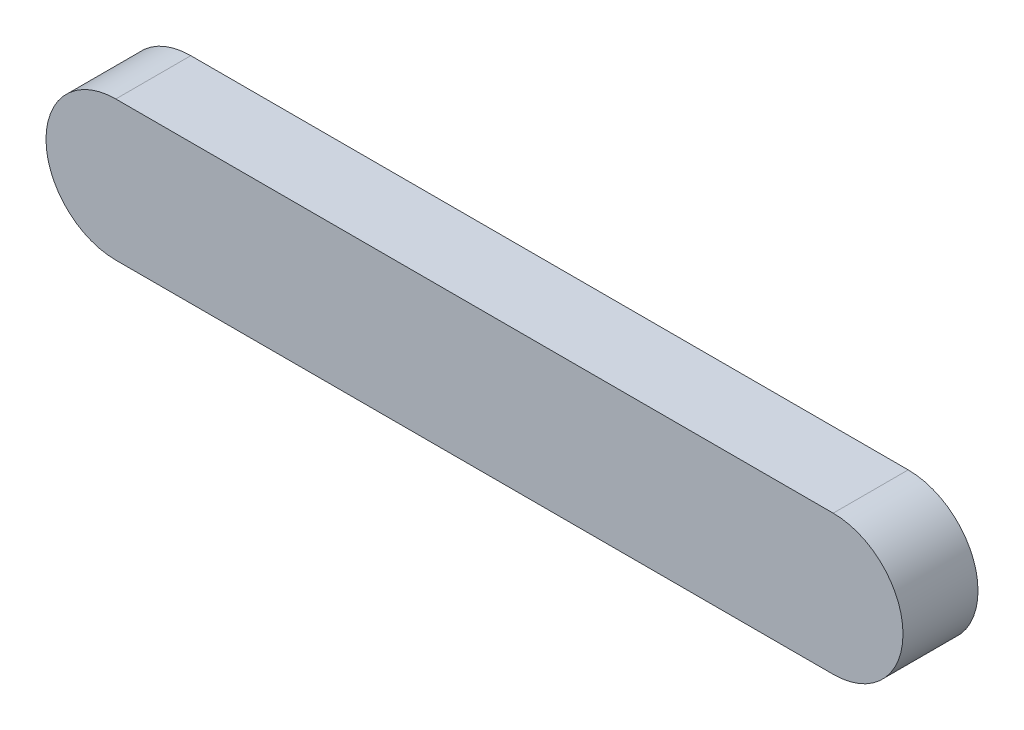
ISO-10303-21;
HEADER;
FILE_DESCRIPTION(('STEP AP214'),'2;1');
FILE_NAME('part.step','',(''),(''),'','','');
FILE_SCHEMA(('AUTOMOTIVE_DESIGN { 1 0 10303 214 1 1 1 1 }'));
ENDSEC;
DATA;
#1=APPLICATION_CONTEXT('core data for automotive mechanical design processes');
#2=APPLICATION_PROTOCOL_DEFINITION('international standard','automotive_design',2000,#1);
#3=PRODUCT_CONTEXT('',#1,'mechanical');
#4=PRODUCT('Part','Part','',(#3));
#5=PRODUCT_RELATED_PRODUCT_CATEGORY('part','',(#4));
#6=PRODUCT_DEFINITION_FORMATION('','',#4);
#7=PRODUCT_DEFINITION_CONTEXT('part definition',#1,'design');
#8=PRODUCT_DEFINITION('design','',#6,#7);
#9=PRODUCT_DEFINITION_SHAPE('','',#8);
#10=(LENGTH_UNIT() NAMED_UNIT(*) SI_UNIT(.MILLI.,.METRE.));
#11=(NAMED_UNIT(*) PLANE_ANGLE_UNIT() SI_UNIT($,.RADIAN.));
#12=(NAMED_UNIT(*) SI_UNIT($,.STERADIAN.) SOLID_ANGLE_UNIT());
#13=UNCERTAINTY_MEASURE_WITH_UNIT(LENGTH_MEASURE(1.E-05),#10,'distance_accuracy_value','');
#14=(GEOMETRIC_REPRESENTATION_CONTEXT(3) GLOBAL_UNCERTAINTY_ASSIGNED_CONTEXT((#13)) GLOBAL_UNIT_ASSIGNED_CONTEXT((#10,
#11,#12)) REPRESENTATION_CONTEXT('',''));
#15=CARTESIAN_POINT('',(0.,0.,0.));
#16=DIRECTION('',(0.,0.,1.));
#17=DIRECTION('',(1.,0.,0.));
#18=AXIS2_PLACEMENT_3D('',#15,#16,#17);
#19=CARTESIAN_POINT('',(41.1168571407103,0.,10.));
#20=DIRECTION('',(0.,0.,-1.));
#21=DIRECTION('',(-1.,0.,0.));
#22=AXIS2_PLACEMENT_3D('',#19,#20,#21);
#23=CYLINDRICAL_SURFACE('',#22,9.30539398447655);
#24=CARTESIAN_POINT('',(41.1168571407103,0.,0.));
#25=DIRECTION('',(0.,0.,1.));
#26=DIRECTION('',(1.,0.,0.));
#27=AXIS2_PLACEMENT_3D('',#24,#25,#26);
#28=CIRCLE('',#27,9.30539398447655);
#29=CARTESIAN_POINT('',(41.1168571407103,-9.30539398447655,0.));
#30=VERTEX_POINT('',#29);
#31=CARTESIAN_POINT('',(41.1168571407103,9.30539398447655,0.));
#32=VERTEX_POINT('',#31);
#33=EDGE_CURVE('E107',#30,#32,#28,.T.);
#34=ORIENTED_EDGE('',*,*,#33,.T.);
#35=DIRECTION('',(0.,0.,-1.));
#36=VECTOR('',#35,1.);
#37=CARTESIAN_POINT('',(41.1168571407103,9.30539398447655,10.));
#38=LINE('',#37,#36);
#39=CARTESIAN_POINT('',(41.1168571407103,9.30539398447655,10.));
#40=VERTEX_POINT('',#39);
#41=EDGE_CURVE('E11',#40,#32,#38,.T.);
#42=ORIENTED_EDGE('',*,*,#41,.F.);
#43=CARTESIAN_POINT('',(41.1168571407103,0.,10.));
#44=DIRECTION('',(0.,0.,1.));
#45=DIRECTION('',(1.,0.,0.));
#46=AXIS2_PLACEMENT_3D('',#43,#44,#45);
#47=CIRCLE('',#46,9.30539398447655);
#48=CARTESIAN_POINT('',(41.1168571407103,-9.30539398447655,10.));
#49=VERTEX_POINT('',#48);
#50=EDGE_CURVE('E91',#49,#40,#47,.T.);
#51=ORIENTED_EDGE('',*,*,#50,.F.);
#52=DIRECTION('',(0.,0.,-1.));
#53=VECTOR('',#52,1.);
#54=CARTESIAN_POINT('',(41.1168571407103,-9.30539398447655,10.));
#55=LINE('',#54,#53);
#56=EDGE_CURVE('E103',#49,#30,#55,.T.);
#57=ORIENTED_EDGE('',*,*,#56,.T.);
#58=EDGE_LOOP('',(#34,#42,#51,#57));
#59=FACE_BOUND('',#58,.T.);
#60=ADVANCED_FACE('F39',(#59),#23,.T.);
#61=CARTESIAN_POINT('',(41.1168571407103,9.30539398447655,10.));
#62=DIRECTION('',(0.,-1.,0.));
#63=DIRECTION('',(0.,0.,-1.));
#64=AXIS2_PLACEMENT_3D('',#61,#62,#63);
#65=PLANE('',#64);
#66=DIRECTION('',(-1.,0.,0.));
#67=VECTOR('',#66,1.);
#68=CARTESIAN_POINT('',(41.1168571407103,9.30539398447655,0.));
#69=LINE('',#68,#67);
#70=CARTESIAN_POINT('',(-54.5339368392579,9.30539398447655,0.));
#71=VERTEX_POINT('',#70);
#72=EDGE_CURVE('E96',#32,#71,#69,.T.);
#73=ORIENTED_EDGE('',*,*,#72,.T.);
#74=DIRECTION('',(0.,0.,-1.));
#75=VECTOR('',#74,1.);
#76=CARTESIAN_POINT('',(-54.5339368392579,9.30539398447655,10.));
#77=LINE('',#76,#75);
#78=CARTESIAN_POINT('',(-54.5339368392579,9.30539398447655,10.));
#79=VERTEX_POINT('',#78);
#80=EDGE_CURVE('E48',#79,#71,#77,.T.);
#81=ORIENTED_EDGE('',*,*,#80,.F.);
#82=DIRECTION('',(-1.,0.,0.));
#83=VECTOR('',#82,1.);
#84=CARTESIAN_POINT('',(41.1168571407103,9.30539398447655,10.));
#85=LINE('',#84,#83);
#86=EDGE_CURVE('E86',#40,#79,#85,.T.);
#87=ORIENTED_EDGE('',*,*,#86,.F.);
#88=ORIENTED_EDGE('',*,*,#41,.T.);
#89=EDGE_LOOP('',(#73,#81,#87,#88));
#90=FACE_BOUND('',#89,.T.);
#91=ADVANCED_FACE('F95',(#90),#65,.F.);
#92=CARTESIAN_POINT('',(-54.5339368392579,0.,10.));
#93=DIRECTION('',(0.,0.,-1.));
#94=DIRECTION('',(-1.,0.,0.));
#95=AXIS2_PLACEMENT_3D('',#92,#93,#94);
#96=CYLINDRICAL_SURFACE('',#95,9.30539398447655);
#97=CARTESIAN_POINT('',(-54.5339368392579,0.,0.));
#98=DIRECTION('',(0.,0.,1.));
#99=DIRECTION('',(1.,0.,0.));
#100=AXIS2_PLACEMENT_3D('',#97,#98,#99);
#101=CIRCLE('',#100,9.30539398447655);
#102=CARTESIAN_POINT('',(-54.5339368392579,-9.30539398447655,0.));
#103=VERTEX_POINT('',#102);
#104=EDGE_CURVE('E73',#71,#103,#101,.T.);
#105=ORIENTED_EDGE('',*,*,#104,.T.);
#106=DIRECTION('',(0.,0.,-1.));
#107=VECTOR('',#106,1.);
#108=CARTESIAN_POINT('',(-54.5339368392579,-9.30539398447655,10.));
#109=LINE('',#108,#107);
#110=CARTESIAN_POINT('',(-54.5339368392579,-9.30539398447655,10.));
#111=VERTEX_POINT('',#110);
#112=EDGE_CURVE('E98',#111,#103,#109,.T.);
#113=ORIENTED_EDGE('',*,*,#112,.F.);
#114=CARTESIAN_POINT('',(-54.5339368392579,0.,10.));
#115=DIRECTION('',(0.,0.,1.));
#116=DIRECTION('',(1.,0.,0.));
#117=AXIS2_PLACEMENT_3D('',#114,#115,#116);
#118=CIRCLE('',#117,9.30539398447655);
#119=EDGE_CURVE('E89',#79,#111,#118,.T.);
#120=ORIENTED_EDGE('',*,*,#119,.F.);
#121=ORIENTED_EDGE('',*,*,#80,.T.);
#122=EDGE_LOOP('',(#105,#113,#120,#121));
#123=FACE_BOUND('',#122,.T.);
#124=ADVANCED_FACE('F99',(#123),#96,.T.);
#125=CARTESIAN_POINT('',(41.1168571407103,-9.30539398447655,10.));
#126=DIRECTION('',(0.,1.,0.));
#127=DIRECTION('',(0.,0.,1.));
#128=AXIS2_PLACEMENT_3D('',#125,#126,#127);
#129=PLANE('',#128);
#130=DIRECTION('',(1.,0.,0.));
#131=VECTOR('',#130,1.);
#132=CARTESIAN_POINT('',(41.1168571407103,-9.30539398447655,0.));
#133=LINE('',#132,#131);
#134=EDGE_CURVE('E79',#103,#30,#133,.T.);
#135=ORIENTED_EDGE('',*,*,#134,.T.);
#136=ORIENTED_EDGE('',*,*,#56,.F.);
#137=DIRECTION('',(1.,0.,0.));
#138=VECTOR('',#137,1.);
#139=CARTESIAN_POINT('',(41.1168571407103,-9.30539398447655,10.));
#140=LINE('',#139,#138);
#141=EDGE_CURVE('E56',#111,#49,#140,.T.);
#142=ORIENTED_EDGE('',*,*,#141,.F.);
#143=ORIENTED_EDGE('',*,*,#112,.T.);
#144=EDGE_LOOP('',(#135,#136,#142,#143));
#145=FACE_BOUND('',#144,.T.);
#146=ADVANCED_FACE('F120',(#145),#129,.F.);
#147=CARTESIAN_POINT('',(41.1168571407103,0.,10.));
#148=DIRECTION('',(0.,0.,1.));
#149=DIRECTION('',(1.,0.,0.));
#150=AXIS2_PLACEMENT_3D('',#147,#148,#149);
#151=PLANE('',#150);
#152=ORIENTED_EDGE('',*,*,#50,.T.);
#153=ORIENTED_EDGE('',*,*,#86,.T.);
#154=ORIENTED_EDGE('',*,*,#119,.T.);
#155=ORIENTED_EDGE('',*,*,#141,.T.);
#156=EDGE_LOOP('',(#152,#153,#154,#155));
#157=FACE_BOUND('',#156,.T.);
#158=ADVANCED_FACE('F87',(#157),#151,.T.);
#159=CARTESIAN_POINT('',(41.1168571407103,0.,0.));
#160=DIRECTION('',(0.,0.,1.));
#161=DIRECTION('',(1.,0.,0.));
#162=AXIS2_PLACEMENT_3D('',#159,#160,#161);
#163=PLANE('',#162);
#164=ORIENTED_EDGE('',*,*,#33,.F.);
#165=ORIENTED_EDGE('',*,*,#134,.F.);
#166=ORIENTED_EDGE('',*,*,#104,.F.);
#167=ORIENTED_EDGE('',*,*,#72,.F.);
#168=EDGE_LOOP('',(#164,#165,#166,#167));
#169=FACE_BOUND('',#168,.T.);
#170=ADVANCED_FACE('F123',(#169),#163,.F.);
#171=CLOSED_SHELL('',(#60,#91,#124,#146,#158,#170));
#172=MANIFOLD_SOLID_BREP('B2',#171);
#173=ADVANCED_BREP_SHAPE_REPRESENTATION('',(#18,#172),#14);
#174=SHAPE_DEFINITION_REPRESENTATION(#9,#173);
ENDSEC;
END-ISO-10303-21;
